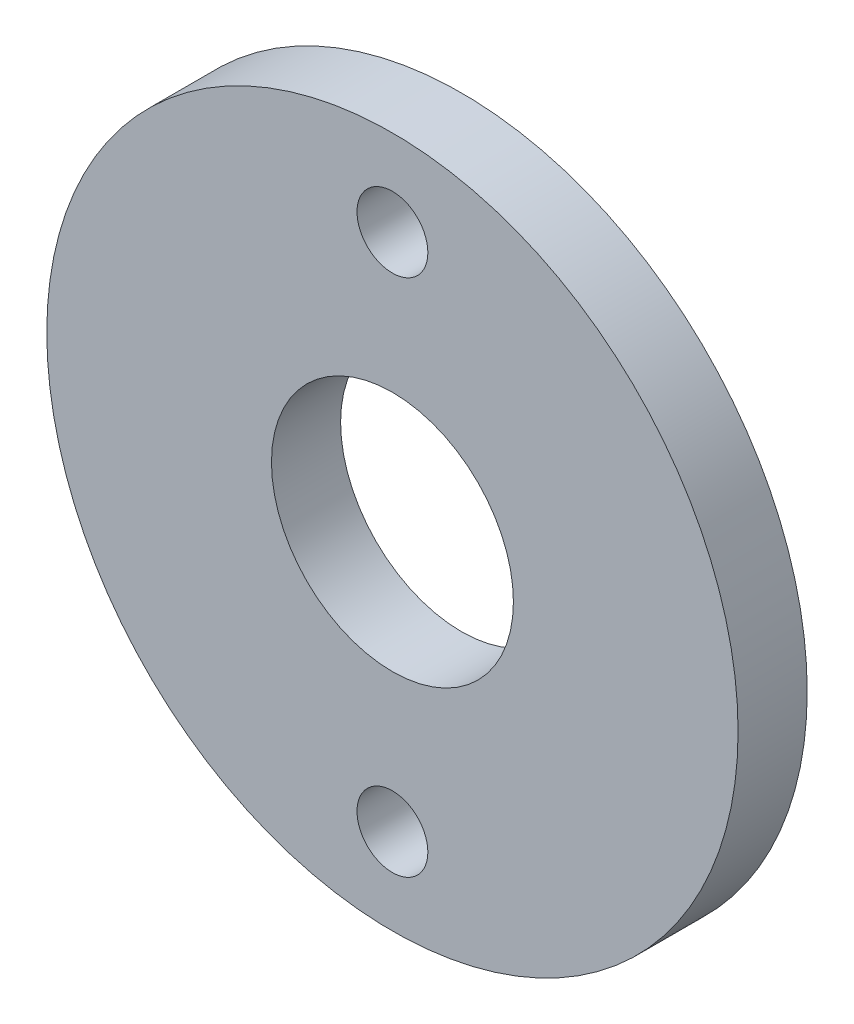
ISO-10303-21;
HEADER;
FILE_DESCRIPTION(('STEP AP214'),'2;1');
FILE_NAME('part.step','',(''),(''),'','','');
FILE_SCHEMA(('AUTOMOTIVE_DESIGN { 1 0 10303 214 1 1 1 1 }'));
ENDSEC;
DATA;
#1=APPLICATION_CONTEXT('core data for automotive mechanical design processes');
#2=APPLICATION_PROTOCOL_DEFINITION('international standard','automotive_design',2000,#1);
#3=PRODUCT_CONTEXT('',#1,'mechanical');
#4=PRODUCT('Part','Part','',(#3));
#5=PRODUCT_RELATED_PRODUCT_CATEGORY('part','',(#4));
#6=PRODUCT_DEFINITION_FORMATION('','',#4);
#7=PRODUCT_DEFINITION_CONTEXT('part definition',#1,'design');
#8=PRODUCT_DEFINITION('design','',#6,#7);
#9=PRODUCT_DEFINITION_SHAPE('','',#8);
#10=(LENGTH_UNIT() NAMED_UNIT(*) SI_UNIT(.MILLI.,.METRE.));
#11=(NAMED_UNIT(*) PLANE_ANGLE_UNIT() SI_UNIT($,.RADIAN.));
#12=(NAMED_UNIT(*) SI_UNIT($,.STERADIAN.) SOLID_ANGLE_UNIT());
#13=UNCERTAINTY_MEASURE_WITH_UNIT(LENGTH_MEASURE(1.E-05),#10,'distance_accuracy_value','');
#14=(GEOMETRIC_REPRESENTATION_CONTEXT(3) GLOBAL_UNCERTAINTY_ASSIGNED_CONTEXT((#13)) GLOBAL_UNIT_ASSIGNED_CONTEXT((#10,
#11,#12)) REPRESENTATION_CONTEXT('',''));
#15=CARTESIAN_POINT('',(0.,0.,0.));
#16=DIRECTION('',(0.,0.,1.));
#17=DIRECTION('',(1.,0.,0.));
#18=AXIS2_PLACEMENT_3D('',#15,#16,#17);
#19=CARTESIAN_POINT('',(0.,0.,2.));
#20=DIRECTION('',(0.,0.,-1.));
#21=DIRECTION('',(-1.,0.,0.));
#22=AXIS2_PLACEMENT_3D('',#19,#20,#21);
#23=CYLINDRICAL_SURFACE('',#22,10.);
#24=CARTESIAN_POINT('',(0.,0.,2.));
#25=DIRECTION('',(0.,0.,1.));
#26=DIRECTION('',(1.,0.,0.));
#27=AXIS2_PLACEMENT_3D('',#24,#25,#26);
#28=CIRCLE('',#27,10.);
#29=CARTESIAN_POINT('',(10.,0.,2.));
#30=VERTEX_POINT('',#29);
#31=EDGE_CURVE('E10',#30,#30,#28,.T.);
#32=ORIENTED_EDGE('',*,*,#31,.F.);
#33=EDGE_LOOP('',(#32));
#34=FACE_BOUND('',#33,.T.);
#35=CARTESIAN_POINT('',(0.,0.,0.));
#36=DIRECTION('',(0.,0.,1.));
#37=DIRECTION('',(1.,0.,0.));
#38=AXIS2_PLACEMENT_3D('',#35,#36,#37);
#39=CIRCLE('',#38,10.);
#40=CARTESIAN_POINT('',(10.,0.,0.));
#41=VERTEX_POINT('',#40);
#42=EDGE_CURVE('E40',#41,#41,#39,.T.);
#43=ORIENTED_EDGE('',*,*,#42,.T.);
#44=EDGE_LOOP('',(#43));
#45=FACE_BOUND('',#44,.T.);
#46=ADVANCED_FACE('F33',(#34,#45),#23,.T.);
#47=CARTESIAN_POINT('',(0.,0.,2.));
#48=DIRECTION('',(0.,0.,1.));
#49=DIRECTION('',(1.,0.,0.));
#50=AXIS2_PLACEMENT_3D('',#47,#48,#49);
#51=PLANE('',#50);
#52=CARTESIAN_POINT('',(0.,0.,2.));
#53=DIRECTION('',(0.,0.,1.));
#54=DIRECTION('',(1.,0.,0.));
#55=AXIS2_PLACEMENT_3D('',#52,#53,#54);
#56=CIRCLE('',#55,3.5);
#57=CARTESIAN_POINT('',(3.5,0.,2.));
#58=VERTEX_POINT('',#57);
#59=EDGE_CURVE('E62',#58,#58,#56,.T.);
#60=ORIENTED_EDGE('',*,*,#59,.F.);
#61=EDGE_LOOP('',(#60));
#62=FACE_BOUND('',#61,.T.);
#63=CARTESIAN_POINT('',(0.,-7.51,2.));
#64=DIRECTION('',(0.,0.,1.));
#65=DIRECTION('',(1.,0.,0.));
#66=AXIS2_PLACEMENT_3D('',#63,#64,#65);
#67=CIRCLE('',#66,1.025);
#68=CARTESIAN_POINT('',(1.025,-7.51,2.));
#69=VERTEX_POINT('',#68);
#70=EDGE_CURVE('E54',#69,#69,#67,.T.);
#71=ORIENTED_EDGE('',*,*,#70,.F.);
#72=EDGE_LOOP('',(#71));
#73=FACE_BOUND('',#72,.T.);
#74=CARTESIAN_POINT('',(0.,7.51,2.));
#75=DIRECTION('',(0.,0.,1.));
#76=DIRECTION('',(1.,0.,0.));
#77=AXIS2_PLACEMENT_3D('',#74,#75,#76);
#78=CIRCLE('',#77,1.025);
#79=CARTESIAN_POINT('',(1.025,7.51,2.));
#80=VERTEX_POINT('',#79);
#81=EDGE_CURVE('E48',#80,#80,#78,.T.);
#82=ORIENTED_EDGE('',*,*,#81,.F.);
#83=EDGE_LOOP('',(#82));
#84=FACE_BOUND('',#83,.T.);
#85=ORIENTED_EDGE('',*,*,#31,.T.);
#86=EDGE_LOOP('',(#85));
#87=FACE_BOUND('',#86,.T.);
#88=ADVANCED_FACE('F70',(#62,#73,#84,#87),#51,.T.);
#89=CARTESIAN_POINT('',(0.,0.,0.));
#90=DIRECTION('',(0.,0.,1.));
#91=DIRECTION('',(1.,0.,0.));
#92=AXIS2_PLACEMENT_3D('',#89,#90,#91);
#93=PLANE('',#92);
#94=CARTESIAN_POINT('',(0.,0.,0.));
#95=DIRECTION('',(0.,0.,1.));
#96=DIRECTION('',(1.,0.,0.));
#97=AXIS2_PLACEMENT_3D('',#94,#95,#96);
#98=CIRCLE('',#97,3.5);
#99=CARTESIAN_POINT('',(3.5,0.,0.));
#100=VERTEX_POINT('',#99);
#101=EDGE_CURVE('E36',#100,#100,#98,.T.);
#102=ORIENTED_EDGE('',*,*,#101,.T.);
#103=EDGE_LOOP('',(#102));
#104=FACE_BOUND('',#103,.T.);
#105=CARTESIAN_POINT('',(0.,-7.51,0.));
#106=DIRECTION('',(0.,0.,1.));
#107=DIRECTION('',(1.,0.,0.));
#108=AXIS2_PLACEMENT_3D('',#105,#106,#107);
#109=CIRCLE('',#108,1.025);
#110=CARTESIAN_POINT('',(1.025,-7.51,0.));
#111=VERTEX_POINT('',#110);
#112=EDGE_CURVE('E52',#111,#111,#109,.T.);
#113=ORIENTED_EDGE('',*,*,#112,.T.);
#114=EDGE_LOOP('',(#113));
#115=FACE_BOUND('',#114,.T.);
#116=CARTESIAN_POINT('',(0.,7.51,0.));
#117=DIRECTION('',(0.,0.,1.));
#118=DIRECTION('',(1.,0.,0.));
#119=AXIS2_PLACEMENT_3D('',#116,#117,#118);
#120=CIRCLE('',#119,1.025);
#121=CARTESIAN_POINT('',(1.025,7.51,0.));
#122=VERTEX_POINT('',#121);
#123=EDGE_CURVE('E45',#122,#122,#120,.T.);
#124=ORIENTED_EDGE('',*,*,#123,.T.);
#125=EDGE_LOOP('',(#124));
#126=FACE_BOUND('',#125,.T.);
#127=ORIENTED_EDGE('',*,*,#42,.F.);
#128=EDGE_LOOP('',(#127));
#129=FACE_BOUND('',#128,.T.);
#130=ADVANCED_FACE('F73',(#104,#115,#126,#129),#93,.F.);
#131=CARTESIAN_POINT('',(0.,7.51,-1.));
#132=DIRECTION('',(0.,0.,1.));
#133=DIRECTION('',(1.,0.,0.));
#134=AXIS2_PLACEMENT_3D('',#131,#132,#133);
#135=CYLINDRICAL_SURFACE('',#134,1.025);
#136=ORIENTED_EDGE('',*,*,#81,.T.);
#137=EDGE_LOOP('',(#136));
#138=FACE_BOUND('',#137,.T.);
#139=ORIENTED_EDGE('',*,*,#123,.F.);
#140=EDGE_LOOP('',(#139));
#141=FACE_BOUND('',#140,.T.);
#142=ADVANCED_FACE('F78',(#138,#141),#135,.F.);
#143=CARTESIAN_POINT('',(0.,-7.51,-1.));
#144=DIRECTION('',(0.,0.,1.));
#145=DIRECTION('',(1.,0.,0.));
#146=AXIS2_PLACEMENT_3D('',#143,#144,#145);
#147=CYLINDRICAL_SURFACE('',#146,1.025);
#148=ORIENTED_EDGE('',*,*,#70,.T.);
#149=EDGE_LOOP('',(#148));
#150=FACE_BOUND('',#149,.T.);
#151=ORIENTED_EDGE('',*,*,#112,.F.);
#152=EDGE_LOOP('',(#151));
#153=FACE_BOUND('',#152,.T.);
#154=ADVANCED_FACE('F81',(#150,#153),#147,.F.);
#155=CARTESIAN_POINT('',(0.,0.,-1.));
#156=DIRECTION('',(0.,0.,1.));
#157=DIRECTION('',(1.,0.,0.));
#158=AXIS2_PLACEMENT_3D('',#155,#156,#157);
#159=CYLINDRICAL_SURFACE('',#158,3.5);
#160=ORIENTED_EDGE('',*,*,#59,.T.);
#161=EDGE_LOOP('',(#160));
#162=FACE_BOUND('',#161,.T.);
#163=ORIENTED_EDGE('',*,*,#101,.F.);
#164=EDGE_LOOP('',(#163));
#165=FACE_BOUND('',#164,.T.);
#166=ADVANCED_FACE('F67',(#162,#165),#159,.F.);
#167=CLOSED_SHELL('',(#46,#88,#130,#142,#154,#166));
#168=MANIFOLD_SOLID_BREP('B2',#167);
#169=ADVANCED_BREP_SHAPE_REPRESENTATION('',(#18,#168),#14);
#170=SHAPE_DEFINITION_REPRESENTATION(#9,#169);
ENDSEC;
END-ISO-10303-21;
